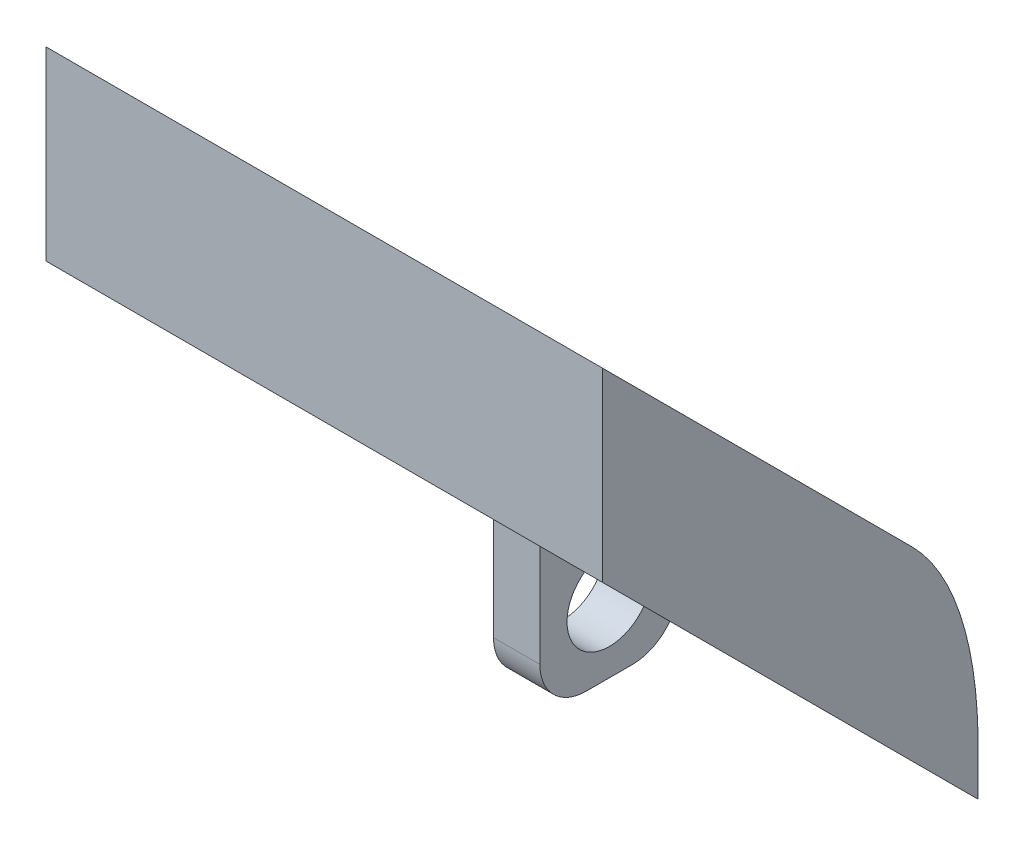
ISO-10303-21;
HEADER;
FILE_DESCRIPTION(('STEP AP214'),'2;1');
FILE_NAME('part.step','',(''),(''),'','','');
FILE_SCHEMA(('AUTOMOTIVE_DESIGN { 1 0 10303 214 1 1 1 1 }'));
ENDSEC;
DATA;
#1=APPLICATION_CONTEXT('core data for automotive mechanical design processes');
#2=APPLICATION_PROTOCOL_DEFINITION('international standard','automotive_design',2000,#1);
#3=PRODUCT_CONTEXT('',#1,'mechanical');
#4=PRODUCT('Part','Part','',(#3));
#5=PRODUCT_RELATED_PRODUCT_CATEGORY('part','',(#4));
#6=PRODUCT_DEFINITION_FORMATION('','',#4);
#7=PRODUCT_DEFINITION_CONTEXT('part definition',#1,'design');
#8=PRODUCT_DEFINITION('design','',#6,#7);
#9=PRODUCT_DEFINITION_SHAPE('','',#8);
#10=(LENGTH_UNIT() NAMED_UNIT(*) SI_UNIT(.MILLI.,.METRE.));
#11=(NAMED_UNIT(*) PLANE_ANGLE_UNIT() SI_UNIT($,.RADIAN.));
#12=(NAMED_UNIT(*) SI_UNIT($,.STERADIAN.) SOLID_ANGLE_UNIT());
#13=UNCERTAINTY_MEASURE_WITH_UNIT(LENGTH_MEASURE(1.E-05),#10,'distance_accuracy_value','');
#14=(GEOMETRIC_REPRESENTATION_CONTEXT(3) GLOBAL_UNCERTAINTY_ASSIGNED_CONTEXT((#13)) GLOBAL_UNIT_ASSIGNED_CONTEXT((#10,
#11,#12)) REPRESENTATION_CONTEXT('',''));
#15=CARTESIAN_POINT('',(0.,0.,0.));
#16=DIRECTION('',(0.,0.,1.));
#17=DIRECTION('',(1.,0.,0.));
#18=AXIS2_PLACEMENT_3D('',#15,#16,#17);
#19=CARTESIAN_POINT('',(76.2,114.3,0.));
#20=DIRECTION('',(0.,0.,-1.));
#21=DIRECTION('',(-1.,0.,0.));
#22=AXIS2_PLACEMENT_3D('',#19,#20,#21);
#23=PLANE('',#22);
#24=DIRECTION('',(-1.,0.,0.));
#25=VECTOR('',#24,1.);
#26=CARTESIAN_POINT('',(76.2,88.9,0.));
#27=LINE('',#26,#25);
#28=CARTESIAN_POINT('',(76.2,88.9,0.));
#29=VERTEX_POINT('',#28);
#30=CARTESIAN_POINT('',(0.,88.9,0.));
#31=VERTEX_POINT('',#30);
#32=EDGE_CURVE('E205',#29,#31,#27,.T.);
#33=ORIENTED_EDGE('',*,*,#32,.F.);
#34=DIRECTION('',(0.,-1.,0.));
#35=VECTOR('',#34,1.);
#36=CARTESIAN_POINT('',(76.2,114.3,0.));
#37=LINE('',#36,#35);
#38=CARTESIAN_POINT('',(76.2,114.3,0.));
#39=VERTEX_POINT('',#38);
#40=EDGE_CURVE('E246',#39,#29,#37,.T.);
#41=ORIENTED_EDGE('',*,*,#40,.F.);
#42=DIRECTION('',(1.,0.,0.));
#43=VECTOR('',#42,1.);
#44=CARTESIAN_POINT('',(76.2,114.3,0.));
#45=LINE('',#44,#43);
#46=CARTESIAN_POINT('',(0.,114.3,0.));
#47=VERTEX_POINT('',#46);
#48=EDGE_CURVE('E240',#47,#39,#45,.T.);
#49=ORIENTED_EDGE('',*,*,#48,.F.);
#50=DIRECTION('',(0.,-1.,0.));
#51=VECTOR('',#50,1.);
#52=CARTESIAN_POINT('',(0.,114.3,0.));
#53=LINE('',#52,#51);
#54=EDGE_CURVE('E243',#47,#31,#53,.T.);
#55=ORIENTED_EDGE('',*,*,#54,.T.);
#56=EDGE_LOOP('',(#33,#41,#49,#55));
#57=FACE_BOUND('',#56,.T.);
#58=ADVANCED_FACE('F40',(#57),#23,.F.);
#59=CARTESIAN_POINT('',(49.1,114.3,-83.2));
#60=DIRECTION('',(-0.950832305113172,0.,0.30970619553566));
#61=DIRECTION('',(0.30970619553566,0.,0.950832305113172));
#62=AXIS2_PLACEMENT_3D('',#59,#60,#61);
#63=PLANE('',#62);
#64=DIRECTION('',(0.,-1.,0.));
#65=VECTOR('',#64,1.);
#66=CARTESIAN_POINT('',(51.3800480769231,114.3,-76.2));
#67=LINE('',#66,#65);
#68=CARTESIAN_POINT('',(51.3800480769231,19.1621559283029,-76.2));
#69=VERTEX_POINT('',#68);
#70=CARTESIAN_POINT('',(51.3800480769231,12.7000000000009,-76.2));
#71=VERTEX_POINT('',#70);
#72=EDGE_CURVE('E237',#69,#71,#67,.T.);
#73=ORIENTED_EDGE('',*,*,#72,.F.);
#74=CARTESIAN_POINT('',(66.2720192307692,19.1621559283029,-30.48));
#75=DIRECTION('',(-0.950832305113172,0.,0.30970619553566));
#76=DIRECTION('',(0.30970619553566,0.,0.950832305113172));
#77=AXIS2_PLACEMENT_3D('',#74,#75,#76);
#78=ELLIPSE('',#77,48.0841887198587,45.72);
#79=CARTESIAN_POINT('',(55.7418054426502,51.491077964152,-62.8089220358488));
#80=VERTEX_POINT('',#79);
#81=EDGE_CURVE('E259',#69,#80,#78,.F.);
#82=ORIENTED_EDGE('',*,*,#81,.T.);
#83=DIRECTION('',(-0.224443514869336,-0.689066436794409,-0.689066436794417));
#84=VECTOR('',#83,1.);
#85=CARTESIAN_POINT('',(61.9674202219783,70.6044045191369,-43.6955954808636));
#86=LINE('',#85,#84);
#87=EDGE_CURVE('E229',#39,#80,#86,.T.);
#88=ORIENTED_EDGE('',*,*,#87,.F.);
#89=ORIENTED_EDGE('',*,*,#40,.T.);
#90=DIRECTION('',(0.224443514869336,0.689066436794409,0.689066436794417));
#91=VECTOR('',#90,1.);
#92=CARTESIAN_POINT('',(65.895695145515,57.2646433987772,-31.6353566012232));
#93=LINE('',#92,#91);
#94=EDGE_CURVE('E235',#71,#29,#93,.T.);
#95=ORIENTED_EDGE('',*,*,#94,.F.);
#96=EDGE_LOOP('',(#73,#82,#88,#89,#95));
#97=FACE_BOUND('',#96,.T.);
#98=ADVANCED_FACE('F307',(#97),#63,.F.);
#99=CARTESIAN_POINT('',(0.,114.3,0.));
#100=DIRECTION('',(0.950832305113172,0.,0.309706195535661));
#101=DIRECTION('',(0.309706195535661,0.,-0.950832305113172));
#102=AXIS2_PLACEMENT_3D('',#99,#100,#101);
#103=PLANE('',#102);
#104=DIRECTION('',(-0.224443514869336,0.689066436794409,0.689066436794418));
#105=VECTOR('',#104,1.);
#106=CARTESIAN_POINT('',(0.,114.3,0.));
#107=LINE('',#106,#105);
#108=CARTESIAN_POINT('',(20.4581945573498,51.491077964152,-62.8089220358488));
#109=VERTEX_POINT('',#108);
#110=EDGE_CURVE('E227',#109,#47,#107,.T.);
#111=ORIENTED_EDGE('',*,*,#110,.F.);
#112=CARTESIAN_POINT('',(9.92798076923077,19.1621559283029,-30.48));
#113=DIRECTION('',(0.950832305113172,0.,0.309706195535661));
#114=DIRECTION('',(0.309706195535661,0.,-0.950832305113172));
#115=AXIS2_PLACEMENT_3D('',#112,#113,#114);
#116=ELLIPSE('',#115,48.0841887198587,45.72);
#117=CARTESIAN_POINT('',(24.8199519230769,19.1621559283029,-76.2));
#118=VERTEX_POINT('',#117);
#119=EDGE_CURVE('E255',#109,#118,#116,.F.);
#120=ORIENTED_EDGE('',*,*,#119,.T.);
#121=DIRECTION('',(0.,-1.,0.));
#122=VECTOR('',#121,1.);
#123=CARTESIAN_POINT('',(24.8199519230769,114.3,-76.2));
#124=LINE('',#123,#122);
#125=CARTESIAN_POINT('',(24.8199519230769,12.7000000000009,-76.2));
#126=VERTEX_POINT('',#125);
#127=EDGE_CURVE('E238',#118,#126,#124,.T.);
#128=ORIENTED_EDGE('',*,*,#127,.T.);
#129=DIRECTION('',(0.224443514869336,-0.689066436794409,-0.689066436794418));
#130=VECTOR('',#129,1.);
#131=CARTESIAN_POINT('',(-3.9282749235367,100.96023887964,12.0602388796403));
#132=LINE('',#131,#130);
#133=EDGE_CURVE('E232',#31,#126,#132,.T.);
#134=ORIENTED_EDGE('',*,*,#133,.F.);
#135=ORIENTED_EDGE('',*,*,#54,.F.);
#136=EDGE_LOOP('',(#111,#120,#128,#134,#135));
#137=FACE_BOUND('',#136,.T.);
#138=ADVANCED_FACE('F313',(#137),#103,.F.);
#139=CARTESIAN_POINT('',(51.3800480769231,114.3,-76.2));
#140=DIRECTION('',(0.,0.,1.));
#141=DIRECTION('',(1.,0.,0.));
#142=AXIS2_PLACEMENT_3D('',#139,#140,#141);
#143=PLANE('',#142);
#144=ORIENTED_EDGE('',*,*,#127,.F.);
#145=DIRECTION('',(-1.,0.,0.));
#146=VECTOR('',#145,1.);
#147=CARTESIAN_POINT('',(51.3800480769231,19.1621559283029,-76.2));
#148=LINE('',#147,#146);
#149=EDGE_CURVE('E257',#118,#69,#148,.F.);
#150=ORIENTED_EDGE('',*,*,#149,.T.);
#151=ORIENTED_EDGE('',*,*,#72,.T.);
#152=DIRECTION('',(1.,0.,0.));
#153=VECTOR('',#152,1.);
#154=CARTESIAN_POINT('',(51.3800480769231,12.7000000000009,-76.2));
#155=LINE('',#154,#153);
#156=EDGE_CURVE('E249',#126,#71,#155,.T.);
#157=ORIENTED_EDGE('',*,*,#156,.F.);
#158=EDGE_LOOP('',(#144,#150,#151,#157));
#159=FACE_BOUND('',#158,.T.);
#160=ADVANCED_FACE('F449',(#159),#143,.F.);
#161=CARTESIAN_POINT('',(76.2,114.3,0.));
#162=DIRECTION('',(0.,0.707106781186552,-0.707106781186543));
#163=DIRECTION('',(0.,0.707106781186543,0.707106781186552));
#164=AXIS2_PLACEMENT_3D('',#161,#162,#163);
#165=PLANE('',#164);
#166=ORIENTED_EDGE('',*,*,#87,.T.);
#167=DIRECTION('',(-1.,0.,0.));
#168=VECTOR('',#167,1.);
#169=CARTESIAN_POINT('',(24.8199519230769,51.491077964152,-62.8089220358488));
#170=LINE('',#169,#168);
#171=EDGE_CURVE('E252',#80,#109,#170,.T.);
#172=ORIENTED_EDGE('',*,*,#171,.T.);
#173=ORIENTED_EDGE('',*,*,#110,.T.);
#174=ORIENTED_EDGE('',*,*,#48,.T.);
#175=EDGE_LOOP('',(#166,#172,#173,#174));
#176=FACE_BOUND('',#175,.T.);
#177=ADVANCED_FACE('F439',(#176),#165,.T.);
#178=CARTESIAN_POINT('',(76.2,88.9,0.));
#179=DIRECTION('',(0.,-0.707106781186552,0.707106781186543));
#180=DIRECTION('',(0.,-0.707106781186543,-0.707106781186552));
#181=AXIS2_PLACEMENT_3D('',#178,#179,#180);
#182=PLANE('',#181);
#183=DIRECTION('',(0.224443514869336,0.689066436794409,0.689066436794417));
#184=VECTOR('',#183,1.);
#185=CARTESIAN_POINT('',(62.7247261915824,57.7810692320198,-31.1189307679806));
#186=LINE('',#185,#184);
#187=CARTESIAN_POINT('',(49.0750329681722,15.8750000000009,-73.025));
#188=VERTEX_POINT('',#187);
#189=CARTESIAN_POINT('',(71.8266555643261,85.7250000000001,-3.175));
#190=VERTEX_POINT('',#189);
#191=EDGE_CURVE('E202',#188,#190,#186,.T.);
#192=ORIENTED_EDGE('',*,*,#191,.F.);
#193=DIRECTION('',(1.,0.,0.));
#194=VECTOR('',#193,1.);
#195=CARTESIAN_POINT('',(51.3800480769231,15.8750000000009,-73.025));
#196=LINE('',#195,#194);
#197=CARTESIAN_POINT('',(27.1249670318278,15.8750000000009,-73.025));
#198=VERTEX_POINT('',#197);
#199=EDGE_CURVE('E193',#198,#188,#196,.T.);
#200=ORIENTED_EDGE('',*,*,#199,.F.);
#201=DIRECTION('',(0.224443514869336,-0.689066436794409,-0.689066436794418));
#202=VECTOR('',#201,1.);
#203=CARTESIAN_POINT('',(-0.757305969604047,101.476664712883,12.576664712883));
#204=LINE('',#203,#202);
#205=CARTESIAN_POINT('',(4.37334443567395,85.7250000000001,-3.175));
#206=VERTEX_POINT('',#205);
#207=EDGE_CURVE('E210',#206,#198,#204,.T.);
#208=ORIENTED_EDGE('',*,*,#207,.F.);
#209=DIRECTION('',(-1.,0.,0.));
#210=VECTOR('',#209,1.);
#211=CARTESIAN_POINT('',(76.2,85.7250000000001,-3.175));
#212=LINE('',#211,#210);
#213=EDGE_CURVE('E188',#190,#206,#212,.T.);
#214=ORIENTED_EDGE('',*,*,#213,.F.);
#215=EDGE_LOOP('',(#192,#200,#208,#214));
#216=FACE_BOUND('',#215,.T.);
#217=ORIENTED_EDGE('',*,*,#94,.T.);
#218=ORIENTED_EDGE('',*,*,#32,.T.);
#219=ORIENTED_EDGE('',*,*,#133,.T.);
#220=ORIENTED_EDGE('',*,*,#156,.T.);
#221=EDGE_LOOP('',(#217,#218,#219,#220));
#222=FACE_BOUND('',#221,.T.);
#223=ADVANCED_FACE('F322',(#216,#222),#182,.T.);
#224=CARTESIAN_POINT('',(76.2,19.1621559283029,-30.48));
#225=DIRECTION('',(1.,0.,0.));
#226=DIRECTION('',(0.,0.,-1.));
#227=AXIS2_PLACEMENT_3D('',#224,#225,#226);
#228=CYLINDRICAL_SURFACE('',#227,45.72);
#229=ORIENTED_EDGE('',*,*,#81,.F.);
#230=ORIENTED_EDGE('',*,*,#149,.F.);
#231=ORIENTED_EDGE('',*,*,#119,.F.);
#232=ORIENTED_EDGE('',*,*,#171,.F.);
#233=EDGE_LOOP('',(#229,#230,#231,#232));
#234=FACE_BOUND('',#233,.T.);
#235=ADVANCED_FACE('F319',(#234),#228,.T.);
#236=CARTESIAN_POINT('',(76.2,114.3,-3.175));
#237=DIRECTION('',(0.,0.,-1.));
#238=DIRECTION('',(-1.,0.,0.));
#239=AXIS2_PLACEMENT_3D('',#236,#237,#238);
#240=PLANE('',#239);
#241=ORIENTED_EDGE('',*,*,#213,.T.);
#242=DIRECTION('',(0.,-1.,0.));
#243=VECTOR('',#242,1.);
#244=CARTESIAN_POINT('',(4.37334443567394,114.3,-3.175));
#245=LINE('',#244,#243);
#246=CARTESIAN_POINT('',(4.37334443567395,106.634871939465,-3.175));
#247=VERTEX_POINT('',#246);
#248=EDGE_CURVE('E194',#247,#206,#245,.T.);
#249=ORIENTED_EDGE('',*,*,#248,.F.);
#250=DIRECTION('',(1.,0.,0.));
#251=VECTOR('',#250,1.);
#252=CARTESIAN_POINT('',(76.2,106.634871939465,-3.175));
#253=LINE('',#252,#251);
#254=CARTESIAN_POINT('',(71.8266555643261,106.634871939465,-3.175));
#255=VERTEX_POINT('',#254);
#256=EDGE_CURVE('E195',#247,#255,#253,.T.);
#257=ORIENTED_EDGE('',*,*,#256,.T.);
#258=DIRECTION('',(0.,-1.,0.));
#259=VECTOR('',#258,1.);
#260=CARTESIAN_POINT('',(71.8266555643261,114.3,-3.175));
#261=LINE('',#260,#259);
#262=EDGE_CURVE('E190',#255,#190,#261,.T.);
#263=ORIENTED_EDGE('',*,*,#262,.T.);
#264=EDGE_LOOP('',(#241,#249,#257,#263));
#265=FACE_BOUND('',#264,.T.);
#266=ADVANCED_FACE('F321',(#265),#240,.T.);
#267=CARTESIAN_POINT('',(46.0811074312657,114.3,-82.2166828291743));
#268=DIRECTION('',(-0.950832305113172,0.,0.30970619553566));
#269=DIRECTION('',(0.30970619553566,0.,0.950832305113172));
#270=AXIS2_PLACEMENT_3D('',#267,#268,#269);
#271=PLANE('',#270);
#272=DIRECTION('',(0.,-1.,0.));
#273=VECTOR('',#272,1.);
#274=CARTESIAN_POINT('',(49.0750329681722,114.3,-73.025));
#275=LINE('',#274,#273);
#276=CARTESIAN_POINT('',(49.0750329681722,19.1621559283029,-73.025));
#277=VERTEX_POINT('',#276);
#278=EDGE_CURVE('E200',#277,#188,#275,.T.);
#279=ORIENTED_EDGE('',*,*,#278,.T.);
#280=ORIENTED_EDGE('',*,*,#191,.T.);
#281=ORIENTED_EDGE('',*,*,#262,.F.);
#282=DIRECTION('',(-0.224443514869336,-0.689066436794409,-0.689066436794417));
#283=VECTOR('',#282,1.);
#284=CARTESIAN_POINT('',(59.4908787272451,68.7626714654758,-41.0472004739901));
#285=LINE('',#284,#283);
#286=CARTESIAN_POINT('',(53.133890516835,49.2460139338847,-60.5638580055815));
#287=VERTEX_POINT('',#286);
#288=EDGE_CURVE('E207',#255,#287,#285,.T.);
#289=ORIENTED_EDGE('',*,*,#288,.T.);
#290=CARTESIAN_POINT('',(62.9328394585568,19.1621559283029,-30.48));
#291=DIRECTION('',(-0.950832305113172,0.,0.30970619553566));
#292=DIRECTION('',(0.30970619553566,0.,0.950832305113172));
#293=AXIS2_PLACEMENT_3D('',#290,#291,#292);
#294=ELLIPSE('',#293,44.7450089476463,42.545);
#295=EDGE_CURVE('E203',#277,#287,#294,.F.);
#296=ORIENTED_EDGE('',*,*,#295,.F.);
#297=EDGE_LOOP('',(#279,#280,#281,#289,#296));
#298=FACE_BOUND('',#297,.T.);
#299=ADVANCED_FACE('F400',(#298),#271,.T.);
#300=CARTESIAN_POINT('',(3.01889256873432,114.3,0.983317170825722));
#301=DIRECTION('',(0.950832305113172,0.,0.309706195535661));
#302=DIRECTION('',(0.309706195535661,0.,-0.950832305113172));
#303=AXIS2_PLACEMENT_3D('',#300,#301,#302);
#304=PLANE('',#303);
#305=DIRECTION('',(-0.224443514869336,0.689066436794409,0.689066436794418));
#306=VECTOR('',#305,1.);
#307=CARTESIAN_POINT('',(2.47654149473319,112.458266946339,2.64839500687347));
#308=LINE('',#307,#306);
#309=CARTESIAN_POINT('',(23.066109483165,49.2460139338847,-60.5638580055815));
#310=VERTEX_POINT('',#309);
#311=EDGE_CURVE('E211',#310,#247,#308,.T.);
#312=ORIENTED_EDGE('',*,*,#311,.T.);
#313=ORIENTED_EDGE('',*,*,#248,.T.);
#314=ORIENTED_EDGE('',*,*,#207,.T.);
#315=DIRECTION('',(0.,-1.,0.));
#316=VECTOR('',#315,1.);
#317=CARTESIAN_POINT('',(27.1249670318278,114.3,-73.025));
#318=LINE('',#317,#316);
#319=CARTESIAN_POINT('',(27.1249670318278,19.1621559283029,-73.025));
#320=VERTEX_POINT('',#319);
#321=EDGE_CURVE('E197',#320,#198,#318,.T.);
#322=ORIENTED_EDGE('',*,*,#321,.F.);
#323=CARTESIAN_POINT('',(13.2671605414432,19.1621559283029,-30.48));
#324=DIRECTION('',(0.950832305113172,0.,0.309706195535661));
#325=DIRECTION('',(0.309706195535661,0.,-0.950832305113172));
#326=AXIS2_PLACEMENT_3D('',#323,#324,#325);
#327=ELLIPSE('',#326,44.7450089476463,42.545);
#328=EDGE_CURVE('E215',#310,#320,#327,.F.);
#329=ORIENTED_EDGE('',*,*,#328,.F.);
#330=EDGE_LOOP('',(#312,#313,#314,#322,#329));
#331=FACE_BOUND('',#330,.T.);
#332=ADVANCED_FACE('F389',(#331),#304,.T.);
#333=CARTESIAN_POINT('',(51.3800480769231,114.3,-73.025));
#334=DIRECTION('',(0.,0.,1.));
#335=DIRECTION('',(1.,0.,0.));
#336=AXIS2_PLACEMENT_3D('',#333,#334,#335);
#337=PLANE('',#336);
#338=ORIENTED_EDGE('',*,*,#321,.T.);
#339=ORIENTED_EDGE('',*,*,#199,.T.);
#340=ORIENTED_EDGE('',*,*,#278,.F.);
#341=DIRECTION('',(1.,0.,0.));
#342=VECTOR('',#341,1.);
#343=CARTESIAN_POINT('',(51.3800480769231,19.1621559283029,-73.025));
#344=LINE('',#343,#342);
#345=EDGE_CURVE('E206',#320,#277,#344,.T.);
#346=ORIENTED_EDGE('',*,*,#345,.F.);
#347=EDGE_LOOP('',(#338,#339,#340,#346));
#348=FACE_BOUND('',#347,.T.);
#349=ADVANCED_FACE('F380',(#348),#337,.T.);
#350=CARTESIAN_POINT('',(76.2,112.054935969733,2.24506403026727));
#351=DIRECTION('',(0.,0.707106781186552,-0.707106781186543));
#352=DIRECTION('',(0.,0.707106781186543,0.707106781186552));
#353=AXIS2_PLACEMENT_3D('',#350,#351,#352);
#354=PLANE('',#353);
#355=DIRECTION('',(1.,0.,0.));
#356=VECTOR('',#355,1.);
#357=CARTESIAN_POINT('',(34.925,64.4416180158243,-45.3682539236417));
#358=LINE('',#357,#356);
#359=CARTESIAN_POINT('',(34.925,64.4416180158243,-45.3682539236417));
#360=VERTEX_POINT('',#359);
#361=CARTESIAN_POINT('',(41.275,64.4416180158243,-45.3682539236417));
#362=VERTEX_POINT('',#361);
#363=EDGE_CURVE('E175',#360,#362,#358,.T.);
#364=ORIENTED_EDGE('',*,*,#363,.F.);
#365=DIRECTION('',(0.,-0.707106781186543,-0.707106781186552));
#366=VECTOR('',#365,1.);
#367=CARTESIAN_POINT('',(34.925,83.4797609924908,-26.330110946975));
#368=LINE('',#367,#366);
#369=CARTESIAN_POINT('',(34.925,83.4797609924908,-26.330110946975));
#370=VERTEX_POINT('',#369);
#371=EDGE_CURVE('E166',#370,#360,#368,.T.);
#372=ORIENTED_EDGE('',*,*,#371,.F.);
#373=DIRECTION('',(-1.,0.,0.));
#374=VECTOR('',#373,1.);
#375=CARTESIAN_POINT('',(34.925,83.4797609924908,-26.330110946975));
#376=LINE('',#375,#374);
#377=CARTESIAN_POINT('',(41.275,83.4797609924908,-26.330110946975));
#378=VERTEX_POINT('',#377);
#379=EDGE_CURVE('E152',#378,#370,#376,.T.);
#380=ORIENTED_EDGE('',*,*,#379,.F.);
#381=DIRECTION('',(0.,0.707106781186543,0.707106781186552));
#382=VECTOR('',#381,1.);
#383=CARTESIAN_POINT('',(41.275,83.4797609924908,-26.330110946975));
#384=LINE('',#383,#382);
#385=EDGE_CURVE('E161',#362,#378,#384,.T.);
#386=ORIENTED_EDGE('',*,*,#385,.F.);
#387=EDGE_LOOP('',(#364,#372,#380,#386));
#388=FACE_BOUND('',#387,.T.);
#389=ORIENTED_EDGE('',*,*,#288,.F.);
#390=ORIENTED_EDGE('',*,*,#256,.F.);
#391=ORIENTED_EDGE('',*,*,#311,.F.);
#392=DIRECTION('',(1.,0.,0.));
#393=VECTOR('',#392,1.);
#394=CARTESIAN_POINT('',(76.2,49.2460139338847,-60.5638580055815));
#395=LINE('',#394,#393);
#396=EDGE_CURVE('E218',#287,#310,#395,.F.);
#397=ORIENTED_EDGE('',*,*,#396,.F.);
#398=EDGE_LOOP('',(#389,#390,#391,#397));
#399=FACE_BOUND('',#398,.T.);
#400=ADVANCED_FACE('F173',(#388,#399),#354,.F.);
#401=CARTESIAN_POINT('',(76.2,19.1621559283029,-30.48));
#402=DIRECTION('',(1.,0.,0.));
#403=DIRECTION('',(0.,0.,-1.));
#404=AXIS2_PLACEMENT_3D('',#401,#402,#403);
#405=CYLINDRICAL_SURFACE('',#404,42.545);
#406=ORIENTED_EDGE('',*,*,#295,.T.);
#407=ORIENTED_EDGE('',*,*,#396,.T.);
#408=ORIENTED_EDGE('',*,*,#328,.T.);
#409=ORIENTED_EDGE('',*,*,#345,.T.);
#410=EDGE_LOOP('',(#406,#407,#408,#409));
#411=FACE_BOUND('',#410,.T.);
#412=ADVANCED_FACE('F295',(#411),#405,.F.);
#413=CARTESIAN_POINT('',(34.925,83.4797609924908,-26.330110946975));
#414=DIRECTION('',(-1.,0.,0.));
#415=DIRECTION('',(0.,0.,1.));
#416=AXIS2_PLACEMENT_3D('',#413,#414,#415);
#417=PLANE('',#416);
#418=CARTESIAN_POINT('',(34.925,51.729760992491,-35.8491824353083));
#419=DIRECTION('',(-1.,0.,0.));
#420=DIRECTION('',(0.,0.,1.));
#421=AXIS2_PLACEMENT_3D('',#418,#419,#420);
#422=CIRCLE('',#421,5.80389999999999);
#423=CARTESIAN_POINT('',(34.925,51.729760992491,-30.0452824353083));
#424=VERTEX_POINT('',#423);
#425=EDGE_CURVE('E285',#424,#424,#422,.T.);
#426=ORIENTED_EDGE('',*,*,#425,.F.);
#427=EDGE_LOOP('',(#426));
#428=FACE_BOUND('',#427,.T.);
#429=DIRECTION('',(0.,-1.,0.));
#430=VECTOR('',#429,1.);
#431=CARTESIAN_POINT('',(34.925,64.4416180158243,-45.3682539236417));
#432=LINE('',#431,#430);
#433=CARTESIAN_POINT('',(34.925,48.5606895041576,-45.3682539236417));
#434=VERTEX_POINT('',#433);
#435=EDGE_CURVE('E170',#360,#434,#432,.T.);
#436=ORIENTED_EDGE('',*,*,#435,.T.);
#437=CARTESIAN_POINT('',(34.925,48.5606895041576,-39.0182539236417));
#438=DIRECTION('',(-1.,0.,0.));
#439=DIRECTION('',(0.,0.,1.));
#440=AXIS2_PLACEMENT_3D('',#437,#438,#439);
#441=CIRCLE('',#440,6.35);
#442=CARTESIAN_POINT('',(34.925,42.2106895041576,-39.0182539236417));
#443=VERTEX_POINT('',#442);
#444=EDGE_CURVE('E265',#434,#443,#441,.T.);
#445=ORIENTED_EDGE('',*,*,#444,.T.);
#446=DIRECTION('',(0.,0.,-1.));
#447=VECTOR('',#446,1.);
#448=CARTESIAN_POINT('',(34.925,42.2106895041576,-26.330110946975));
#449=LINE('',#448,#447);
#450=CARTESIAN_POINT('',(34.925,42.2106895041576,-32.680110946975));
#451=VERTEX_POINT('',#450);
#452=EDGE_CURVE('E179',#451,#443,#449,.T.);
#453=ORIENTED_EDGE('',*,*,#452,.F.);
#454=CARTESIAN_POINT('',(34.925,48.5606895041576,-32.680110946975));
#455=DIRECTION('',(-1.,0.,0.));
#456=DIRECTION('',(0.,0.,1.));
#457=AXIS2_PLACEMENT_3D('',#454,#455,#456);
#458=CIRCLE('',#457,6.35);
#459=CARTESIAN_POINT('',(34.925,48.5606895041576,-26.330110946975));
#460=VERTEX_POINT('',#459);
#461=EDGE_CURVE('E169',#451,#460,#458,.T.);
#462=ORIENTED_EDGE('',*,*,#461,.T.);
#463=DIRECTION('',(0.,-1.,0.));
#464=VECTOR('',#463,1.);
#465=CARTESIAN_POINT('',(34.925,83.4797609924908,-26.330110946975));
#466=LINE('',#465,#464);
#467=EDGE_CURVE('E155',#370,#460,#466,.T.);
#468=ORIENTED_EDGE('',*,*,#467,.F.);
#469=ORIENTED_EDGE('',*,*,#371,.T.);
#470=EDGE_LOOP('',(#436,#445,#453,#462,#468,#469));
#471=FACE_BOUND('',#470,.T.);
#472=ADVANCED_FACE('F165',(#428,#471),#417,.T.);
#473=CARTESIAN_POINT('',(34.925,64.4416180158243,-45.3682539236417));
#474=DIRECTION('',(0.,0.,-1.));
#475=DIRECTION('',(0.,1.,0.));
#476=AXIS2_PLACEMENT_3D('',#473,#474,#475);
#477=PLANE('',#476);
#478=DIRECTION('',(0.,-1.,0.));
#479=VECTOR('',#478,1.);
#480=CARTESIAN_POINT('',(41.275,64.4416180158243,-45.3682539236417));
#481=LINE('',#480,#479);
#482=CARTESIAN_POINT('',(41.275,48.5606895041576,-45.3682539236417));
#483=VERTEX_POINT('',#482);
#484=EDGE_CURVE('E183',#362,#483,#481,.T.);
#485=ORIENTED_EDGE('',*,*,#484,.T.);
#486=DIRECTION('',(-1.,0.,0.));
#487=VECTOR('',#486,1.);
#488=CARTESIAN_POINT('',(34.925,48.5606895041576,-45.3682539236417));
#489=LINE('',#488,#487);
#490=EDGE_CURVE('E261',#483,#434,#489,.T.);
#491=ORIENTED_EDGE('',*,*,#490,.T.);
#492=ORIENTED_EDGE('',*,*,#435,.F.);
#493=ORIENTED_EDGE('',*,*,#363,.T.);
#494=EDGE_LOOP('',(#485,#491,#492,#493));
#495=FACE_BOUND('',#494,.T.);
#496=ADVANCED_FACE('F279',(#495),#477,.T.);
#497=CARTESIAN_POINT('',(41.275,83.4797609924908,-26.330110946975));
#498=DIRECTION('',(1.,0.,0.));
#499=DIRECTION('',(0.,0.,-1.));
#500=AXIS2_PLACEMENT_3D('',#497,#498,#499);
#501=PLANE('',#500);
#502=CARTESIAN_POINT('',(41.275,51.729760992491,-35.8491824353083));
#503=DIRECTION('',(1.,0.,0.));
#504=DIRECTION('',(0.,0.,-1.));
#505=AXIS2_PLACEMENT_3D('',#502,#503,#504);
#506=CIRCLE('',#505,5.8039);
#507=CARTESIAN_POINT('',(41.275,51.729760992491,-41.6530824353083));
#508=VERTEX_POINT('',#507);
#509=EDGE_CURVE('E283',#508,#508,#506,.T.);
#510=ORIENTED_EDGE('',*,*,#509,.F.);
#511=EDGE_LOOP('',(#510));
#512=FACE_BOUND('',#511,.T.);
#513=DIRECTION('',(0.,0.,-1.));
#514=VECTOR('',#513,1.);
#515=CARTESIAN_POINT('',(41.275,42.2106895041576,-26.3301109469749));
#516=LINE('',#515,#514);
#517=CARTESIAN_POINT('',(41.275,42.2106895041576,-32.680110946975));
#518=VERTEX_POINT('',#517);
#519=CARTESIAN_POINT('',(41.275,42.2106895041576,-39.0182539236417));
#520=VERTEX_POINT('',#519);
#521=EDGE_CURVE('E176',#518,#520,#516,.T.);
#522=ORIENTED_EDGE('',*,*,#521,.T.);
#523=CARTESIAN_POINT('',(41.275,48.5606895041576,-39.0182539236417));
#524=DIRECTION('',(1.,0.,0.));
#525=DIRECTION('',(0.,0.,-1.));
#526=AXIS2_PLACEMENT_3D('',#523,#524,#525);
#527=CIRCLE('',#526,6.35);
#528=EDGE_CURVE('E48',#520,#483,#527,.T.);
#529=ORIENTED_EDGE('',*,*,#528,.T.);
#530=ORIENTED_EDGE('',*,*,#484,.F.);
#531=ORIENTED_EDGE('',*,*,#385,.T.);
#532=DIRECTION('',(0.,-1.,0.));
#533=VECTOR('',#532,1.);
#534=CARTESIAN_POINT('',(41.275,83.4797609924908,-26.330110946975));
#535=LINE('',#534,#533);
#536=CARTESIAN_POINT('',(41.275,48.5606895041576,-26.330110946975));
#537=VERTEX_POINT('',#536);
#538=EDGE_CURVE('E156',#378,#537,#535,.T.);
#539=ORIENTED_EDGE('',*,*,#538,.T.);
#540=CARTESIAN_POINT('',(41.275,48.5606895041576,-32.680110946975));
#541=DIRECTION('',(1.,0.,0.));
#542=DIRECTION('',(0.,0.,-1.));
#543=AXIS2_PLACEMENT_3D('',#540,#541,#542);
#544=CIRCLE('',#543,6.35);
#545=EDGE_CURVE('E271',#537,#518,#544,.T.);
#546=ORIENTED_EDGE('',*,*,#545,.T.);
#547=EDGE_LOOP('',(#522,#529,#530,#531,#539,#546));
#548=FACE_BOUND('',#547,.T.);
#549=ADVANCED_FACE('F275',(#512,#548),#501,.T.);
#550=CARTESIAN_POINT('',(34.925,83.4797609924908,-26.330110946975));
#551=DIRECTION('',(0.,0.,1.));
#552=DIRECTION('',(0.,-1.,0.));
#553=AXIS2_PLACEMENT_3D('',#550,#551,#552);
#554=PLANE('',#553);
#555=ORIENTED_EDGE('',*,*,#467,.T.);
#556=DIRECTION('',(-1.,0.,0.));
#557=VECTOR('',#556,1.);
#558=CARTESIAN_POINT('',(41.275,48.5606895041576,-26.330110946975));
#559=LINE('',#558,#557);
#560=EDGE_CURVE('E11',#460,#537,#559,.F.);
#561=ORIENTED_EDGE('',*,*,#560,.T.);
#562=ORIENTED_EDGE('',*,*,#538,.F.);
#563=ORIENTED_EDGE('',*,*,#379,.T.);
#564=EDGE_LOOP('',(#555,#561,#562,#563));
#565=FACE_BOUND('',#564,.T.);
#566=ADVANCED_FACE('F154',(#565),#554,.T.);
#567=CARTESIAN_POINT('',(76.201,42.2106895041576,-26.3301109469749));
#568=DIRECTION('',(0.,1.,0.));
#569=DIRECTION('',(-1.,0.,0.));
#570=AXIS2_PLACEMENT_3D('',#567,#568,#569);
#571=PLANE('',#570);
#572=ORIENTED_EDGE('',*,*,#452,.T.);
#573=DIRECTION('',(-1.,0.,0.));
#574=VECTOR('',#573,1.);
#575=CARTESIAN_POINT('',(41.275,42.2106895041576,-39.0182539236417));
#576=LINE('',#575,#574);
#577=EDGE_CURVE('E61',#443,#520,#576,.F.);
#578=ORIENTED_EDGE('',*,*,#577,.T.);
#579=ORIENTED_EDGE('',*,*,#521,.F.);
#580=DIRECTION('',(-1.,0.,0.));
#581=VECTOR('',#580,1.);
#582=CARTESIAN_POINT('',(34.925,42.2106895041576,-32.680110946975));
#583=LINE('',#582,#581);
#584=EDGE_CURVE('E267',#518,#451,#583,.T.);
#585=ORIENTED_EDGE('',*,*,#584,.T.);
#586=EDGE_LOOP('',(#572,#578,#579,#585));
#587=FACE_BOUND('',#586,.T.);
#588=ADVANCED_FACE('F281',(#587),#571,.F.);
#589=CARTESIAN_POINT('',(34.925,51.729760992491,-35.8491824353083));
#590=DIRECTION('',(-1.,0.,0.));
#591=DIRECTION('',(0.,0.,1.));
#592=AXIS2_PLACEMENT_3D('',#589,#590,#591);
#593=CYLINDRICAL_SURFACE('',#592,5.8039);
#594=ORIENTED_EDGE('',*,*,#425,.T.);
#595=EDGE_LOOP('',(#594));
#596=FACE_BOUND('',#595,.T.);
#597=ORIENTED_EDGE('',*,*,#509,.T.);
#598=EDGE_LOOP('',(#597));
#599=FACE_BOUND('',#598,.T.);
#600=ADVANCED_FACE('F291',(#596,#599),#593,.F.);
#601=CARTESIAN_POINT('',(34.925,48.5606895041576,-39.0182539236417));
#602=DIRECTION('',(1.,0.,0.));
#603=DIRECTION('',(0.,1.,0.));
#604=AXIS2_PLACEMENT_3D('',#601,#602,#603);
#605=CYLINDRICAL_SURFACE('',#604,6.35);
#606=ORIENTED_EDGE('',*,*,#528,.F.);
#607=ORIENTED_EDGE('',*,*,#577,.F.);
#608=ORIENTED_EDGE('',*,*,#444,.F.);
#609=ORIENTED_EDGE('',*,*,#490,.F.);
#610=EDGE_LOOP('',(#606,#607,#608,#609));
#611=FACE_BOUND('',#610,.T.);
#612=ADVANCED_FACE('F280',(#611),#605,.T.);
#613=CARTESIAN_POINT('',(76.201,48.5606895041576,-32.680110946975));
#614=DIRECTION('',(1.,0.,0.));
#615=DIRECTION('',(0.,1.,0.));
#616=AXIS2_PLACEMENT_3D('',#613,#614,#615);
#617=CYLINDRICAL_SURFACE('',#616,6.35);
#618=ORIENTED_EDGE('',*,*,#545,.F.);
#619=ORIENTED_EDGE('',*,*,#560,.F.);
#620=ORIENTED_EDGE('',*,*,#461,.F.);
#621=ORIENTED_EDGE('',*,*,#584,.F.);
#622=EDGE_LOOP('',(#618,#619,#620,#621));
#623=FACE_BOUND('',#622,.T.);
#624=ADVANCED_FACE('F42',(#623),#617,.T.);
#625=CLOSED_SHELL('',(#58,#98,#138,#160,#177,#223,#235,#266,#299,#332,#349,#400,#412,#472,#496,
#549,#566,#588,#600,#612,#624));
#626=MANIFOLD_SOLID_BREP('B2',#625);
#627=ADVANCED_BREP_SHAPE_REPRESENTATION('',(#18,#626),#14);
#628=SHAPE_DEFINITION_REPRESENTATION(#9,#627);
ENDSEC;
END-ISO-10303-21;
